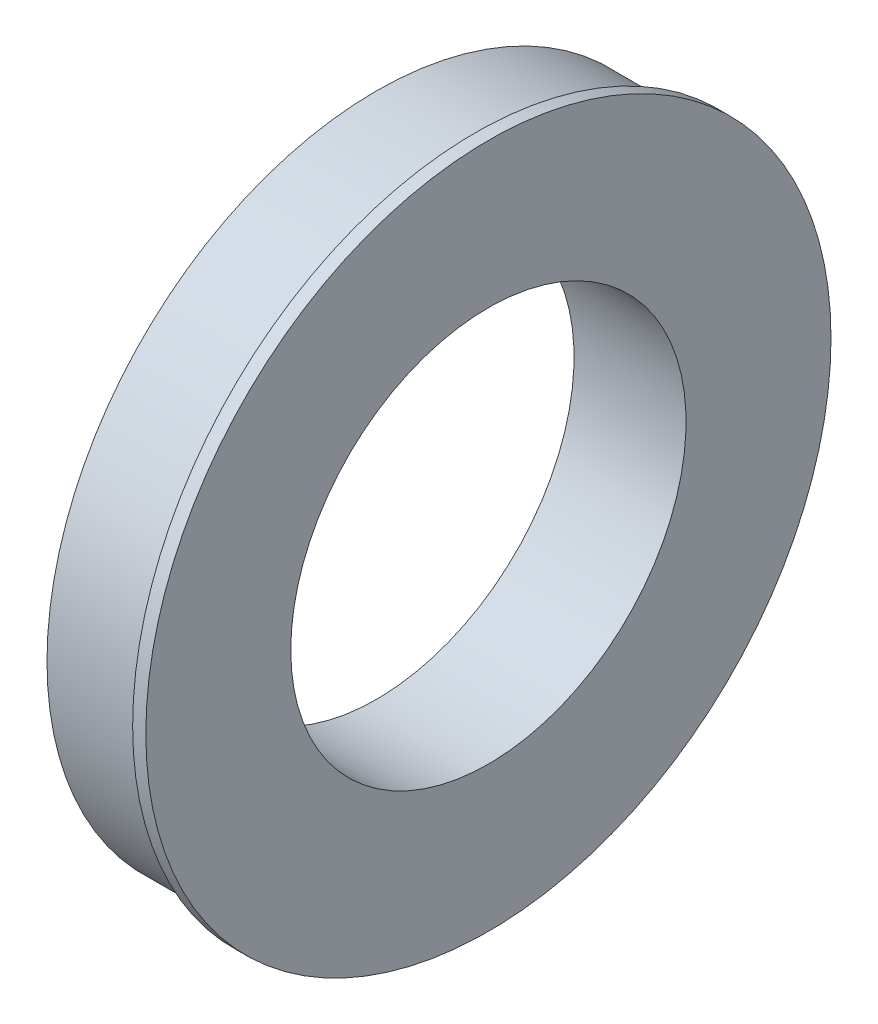
ISO-10303-21;
HEADER;
FILE_DESCRIPTION(('STEP AP214'),'2;1');
FILE_NAME('part.step','',(''),(''),'','','');
FILE_SCHEMA(('AUTOMOTIVE_DESIGN { 1 0 10303 214 1 1 1 1 }'));
ENDSEC;
DATA;
#1=APPLICATION_CONTEXT('core data for automotive mechanical design processes');
#2=APPLICATION_PROTOCOL_DEFINITION('international standard','automotive_design',2000,#1);
#3=PRODUCT_CONTEXT('',#1,'mechanical');
#4=PRODUCT('Part','Part','',(#3));
#5=PRODUCT_RELATED_PRODUCT_CATEGORY('part','',(#4));
#6=PRODUCT_DEFINITION_FORMATION('','',#4);
#7=PRODUCT_DEFINITION_CONTEXT('part definition',#1,'design');
#8=PRODUCT_DEFINITION('design','',#6,#7);
#9=PRODUCT_DEFINITION_SHAPE('','',#8);
#10=(LENGTH_UNIT() NAMED_UNIT(*) SI_UNIT(.MILLI.,.METRE.));
#11=(NAMED_UNIT(*) PLANE_ANGLE_UNIT() SI_UNIT($,.RADIAN.));
#12=(NAMED_UNIT(*) SI_UNIT($,.STERADIAN.) SOLID_ANGLE_UNIT());
#13=UNCERTAINTY_MEASURE_WITH_UNIT(LENGTH_MEASURE(1.E-05),#10,'distance_accuracy_value','');
#14=(GEOMETRIC_REPRESENTATION_CONTEXT(3) GLOBAL_UNCERTAINTY_ASSIGNED_CONTEXT((#13)) GLOBAL_UNIT_ASSIGNED_CONTEXT((#10,
#11,#12)) REPRESENTATION_CONTEXT('',''));
#15=CARTESIAN_POINT('',(0.,0.,0.));
#16=DIRECTION('',(0.,0.,1.));
#17=DIRECTION('',(1.,0.,0.));
#18=AXIS2_PLACEMENT_3D('',#15,#16,#17);
#19=CARTESIAN_POINT('',(0.,0.,0.));
#20=DIRECTION('',(1.,0.,0.));
#21=DIRECTION('',(0.,0.,-1.));
#22=AXIS2_PLACEMENT_3D('',#19,#20,#21);
#23=PLANE('',#22);
#24=CARTESIAN_POINT('',(0.,0.,0.));
#25=DIRECTION('',(1.,0.,0.));
#26=DIRECTION('',(0.,0.,-1.));
#27=AXIS2_PLACEMENT_3D('',#24,#25,#26);
#28=CIRCLE('',#27,63.5);
#29=CARTESIAN_POINT('',(0.,0.,63.5));
#30=VERTEX_POINT('',#29);
#31=EDGE_CURVE('E35',#30,#30,#28,.T.);
#32=ORIENTED_EDGE('',*,*,#31,.F.);
#33=EDGE_LOOP('',(#32));
#34=FACE_BOUND('',#33,.T.);
#35=CARTESIAN_POINT('',(0.,0.,0.));
#36=DIRECTION('',(1.,0.,0.));
#37=DIRECTION('',(0.,0.,-1.));
#38=AXIS2_PLACEMENT_3D('',#35,#36,#37);
#39=CIRCLE('',#38,38.1);
#40=CARTESIAN_POINT('',(0.,0.,38.1));
#41=VERTEX_POINT('',#40);
#42=EDGE_CURVE('E42',#41,#41,#39,.T.);
#43=ORIENTED_EDGE('',*,*,#42,.T.);
#44=EDGE_LOOP('',(#43));
#45=FACE_BOUND('',#44,.T.);
#46=ADVANCED_FACE('F31',(#34,#45),#23,.F.);
#47=CARTESIAN_POINT('',(19.05,0.,0.));
#48=DIRECTION('',(-1.,0.,0.));
#49=DIRECTION('',(0.,0.,1.));
#50=AXIS2_PLACEMENT_3D('',#47,#48,#49);
#51=CYLINDRICAL_SURFACE('',#50,63.5);
#52=CARTESIAN_POINT('',(19.05,0.,0.));
#53=DIRECTION('',(1.,0.,0.));
#54=DIRECTION('',(0.,0.,-1.));
#55=AXIS2_PLACEMENT_3D('',#52,#53,#54);
#56=CIRCLE('',#55,63.5);
#57=CARTESIAN_POINT('',(19.05,0.,63.5));
#58=VERTEX_POINT('',#57);
#59=EDGE_CURVE('E10',#58,#58,#56,.T.);
#60=CARTESIAN_POINT('',(19.05,0.,63.5));
#61=CARTESIAN_POINT('',(18.8515625,0.,63.5));
#62=CARTESIAN_POINT('',(18.653125,0.,63.5));
#63=CARTESIAN_POINT('',(18.25625,0.,63.5));
#64=CARTESIAN_POINT('',(18.0578125,0.,63.5));
#65=CARTESIAN_POINT('',(17.6609375,0.,63.5));
#66=CARTESIAN_POINT('',(17.4625,0.,63.5));
#67=CARTESIAN_POINT('',(17.065625,0.,63.5));
#68=CARTESIAN_POINT('',(16.8671875,0.,63.5));
#69=CARTESIAN_POINT('',(16.4703125,0.,63.5));
#70=CARTESIAN_POINT('',(16.271875,0.,63.5));
#71=CARTESIAN_POINT('',(15.875,0.,63.5));
#72=CARTESIAN_POINT('',(15.6765625,0.,63.5));
#73=CARTESIAN_POINT('',(15.2796875,0.,63.5));
#74=CARTESIAN_POINT('',(15.08125,0.,63.5));
#75=CARTESIAN_POINT('',(14.684375,0.,63.5));
#76=CARTESIAN_POINT('',(14.4859375,0.,63.5));
#77=CARTESIAN_POINT('',(14.0890625,0.,63.5));
#78=CARTESIAN_POINT('',(13.890625,0.,63.5));
#79=CARTESIAN_POINT('',(13.49375,0.,63.5));
#80=CARTESIAN_POINT('',(13.2953125,0.,63.5));
#81=CARTESIAN_POINT('',(12.8984375,0.,63.5));
#82=CARTESIAN_POINT('',(12.7,0.,63.5));
#83=CARTESIAN_POINT('',(12.303125,0.,63.5));
#84=CARTESIAN_POINT('',(12.1046875,0.,63.5));
#85=CARTESIAN_POINT('',(11.7078125,0.,63.5));
#86=CARTESIAN_POINT('',(11.509375,0.,63.5));
#87=CARTESIAN_POINT('',(11.1125,0.,63.5));
#88=CARTESIAN_POINT('',(10.9140625,0.,63.5));
#89=CARTESIAN_POINT('',(10.5171875,0.,63.5));
#90=CARTESIAN_POINT('',(10.31875,0.,63.5));
#91=CARTESIAN_POINT('',(9.921875,0.,63.5));
#92=CARTESIAN_POINT('',(9.7234375,0.,63.5));
#93=CARTESIAN_POINT('',(9.3265625,0.,63.5));
#94=CARTESIAN_POINT('',(9.128125,0.,63.5));
#95=CARTESIAN_POINT('',(8.73125,0.,63.5));
#96=CARTESIAN_POINT('',(8.5328125,0.,63.5));
#97=CARTESIAN_POINT('',(8.1359375,0.,63.5));
#98=CARTESIAN_POINT('',(7.9375,0.,63.5));
#99=CARTESIAN_POINT('',(7.540625,0.,63.5));
#100=CARTESIAN_POINT('',(7.3421875,0.,63.5));
#101=CARTESIAN_POINT('',(6.9453125,0.,63.5));
#102=CARTESIAN_POINT('',(6.746875,0.,63.5));
#103=CARTESIAN_POINT('',(6.35,0.,63.5));
#104=CARTESIAN_POINT('',(6.1515625,0.,63.5));
#105=CARTESIAN_POINT('',(5.7546875,0.,63.5));
#106=CARTESIAN_POINT('',(5.55625,0.,63.5));
#107=CARTESIAN_POINT('',(5.159375,0.,63.5));
#108=CARTESIAN_POINT('',(4.9609375,0.,63.5));
#109=CARTESIAN_POINT('',(4.5640625,0.,63.5));
#110=CARTESIAN_POINT('',(4.365625,0.,63.5));
#111=CARTESIAN_POINT('',(3.96875,0.,63.5));
#112=CARTESIAN_POINT('',(3.7703125,0.,63.5));
#113=CARTESIAN_POINT('',(3.3734375,0.,63.5));
#114=CARTESIAN_POINT('',(3.175,0.,63.5));
#115=CARTESIAN_POINT('',(2.778125,0.,63.5));
#116=CARTESIAN_POINT('',(2.5796875,0.,63.5));
#117=CARTESIAN_POINT('',(2.1828125,0.,63.5));
#118=CARTESIAN_POINT('',(1.984375,0.,63.5));
#119=CARTESIAN_POINT('',(1.5875,0.,63.5));
#120=CARTESIAN_POINT('',(1.3890625,0.,63.5));
#121=CARTESIAN_POINT('',(0.992187500000001,0.,63.5));
#122=CARTESIAN_POINT('',(0.793750000000001,0.,63.5));
#123=CARTESIAN_POINT('',(0.396875,0.,63.5));
#124=CARTESIAN_POINT('',(0.1984375,0.,63.5));
#125=CARTESIAN_POINT('',(0.,0.,63.5));
#126=B_SPLINE_CURVE_WITH_KNOTS('',3,(#60,#61,#62,#63,#64,#65,#66,#67,#68,#69,#70,#71,#72,#73,
#74,#75,#76,#77,#78,#79,#80,#81,#82,#83,#84,#85,#86,#87,#88,#89,#90,#91,#92,#93,#94,#95,#96,#97,
#98,#99,#100,#101,#102,#103,#104,#105,#106,#107,#108,#109,#110,#111,#112,#113,#114,#115,#116,
#117,#118,#119,#120,#121,#122,#123,#124,#125),.UNSPECIFIED.,.F.,.F.,(4,2,2,2,2,2,2,2,2,2,2,2,2,
2,2,2,2,2,2,2,2,2,2,2,2,2,2,2,2,2,2,2,4),(0.,0.5953125,1.190625,1.7859375,2.38125,2.9765625,
3.571875,4.1671875,4.7625,5.3578125,5.953125,6.5484375,7.14375,7.7390625,8.334375,8.9296875,
9.525,10.1203125,10.715625,11.3109375,11.90625,12.5015625,13.096875,13.6921875,14.2875,
14.8828125,15.478125,16.0734375,16.66875,17.2640625,17.859375,18.4546875,19.05),.UNSPECIFIED.);
#127=EDGE_CURVE('BSEAM33',#58,#30,#126,.T.);
#128=ORIENTED_EDGE('',*,*,#59,.F.);
#129=ORIENTED_EDGE('',*,*,#31,.T.);
#130=ORIENTED_EDGE('',*,*,#127,.T.);
#131=ORIENTED_EDGE('',*,*,#127,.F.);
#132=EDGE_LOOP('',(#128,#130,#129,#131));
#133=FACE_BOUND('',#132,.T.);
#134=ADVANCED_FACE('F33',(#133),#51,.T.);
#135=CARTESIAN_POINT('',(19.05,0.,0.));
#136=DIRECTION('',(-1.,0.,0.));
#137=DIRECTION('',(0.,0.,1.));
#138=AXIS2_PLACEMENT_3D('',#135,#136,#137);
#139=CYLINDRICAL_SURFACE('',#138,38.1);
#140=CARTESIAN_POINT('',(21.59,0.,0.));
#141=DIRECTION('',(1.,0.,0.));
#142=DIRECTION('',(0.,0.,-1.));
#143=AXIS2_PLACEMENT_3D('',#140,#141,#142);
#144=CIRCLE('',#143,38.1);
#145=CARTESIAN_POINT('',(21.59,0.,38.1));
#146=VERTEX_POINT('',#145);
#147=EDGE_CURVE('E50',#146,#146,#144,.T.);
#148=CARTESIAN_POINT('',(0.,0.,38.1));
#149=CARTESIAN_POINT('',(0.224895833333333,0.,38.1));
#150=CARTESIAN_POINT('',(0.449791666666667,0.,38.1));
#151=CARTESIAN_POINT('',(0.899583333333333,0.,38.1));
#152=CARTESIAN_POINT('',(1.12447916666667,0.,38.1));
#153=CARTESIAN_POINT('',(1.57427083333333,0.,38.1));
#154=CARTESIAN_POINT('',(1.79916666666667,0.,38.1));
#155=CARTESIAN_POINT('',(2.24895833333333,0.,38.1));
#156=CARTESIAN_POINT('',(2.47385416666667,0.,38.1));
#157=CARTESIAN_POINT('',(2.92364583333333,0.,38.1));
#158=CARTESIAN_POINT('',(3.14854166666667,0.,38.1));
#159=CARTESIAN_POINT('',(3.59833333333333,0.,38.1));
#160=CARTESIAN_POINT('',(3.82322916666667,0.,38.1));
#161=CARTESIAN_POINT('',(4.27302083333333,0.,38.1));
#162=CARTESIAN_POINT('',(4.49791666666667,0.,38.1));
#163=CARTESIAN_POINT('',(4.94770833333333,0.,38.1));
#164=CARTESIAN_POINT('',(5.17260416666667,0.,38.1));
#165=CARTESIAN_POINT('',(5.62239583333333,0.,38.1));
#166=CARTESIAN_POINT('',(5.84729166666667,0.,38.1));
#167=CARTESIAN_POINT('',(6.29708333333333,0.,38.1));
#168=CARTESIAN_POINT('',(6.52197916666667,0.,38.1));
#169=CARTESIAN_POINT('',(6.97177083333333,0.,38.1));
#170=CARTESIAN_POINT('',(7.19666666666667,0.,38.1));
#171=CARTESIAN_POINT('',(7.64645833333333,0.,38.1));
#172=CARTESIAN_POINT('',(7.87135416666667,0.,38.1));
#173=CARTESIAN_POINT('',(8.32114583333333,0.,38.1));
#174=CARTESIAN_POINT('',(8.54604166666667,0.,38.1));
#175=CARTESIAN_POINT('',(8.99583333333334,0.,38.1));
#176=CARTESIAN_POINT('',(9.22072916666667,0.,38.1));
#177=CARTESIAN_POINT('',(9.67052083333333,0.,38.1));
#178=CARTESIAN_POINT('',(9.89541666666667,0.,38.1));
#179=CARTESIAN_POINT('',(10.3452083333333,0.,38.1));
#180=CARTESIAN_POINT('',(10.5701041666667,0.,38.1));
#181=CARTESIAN_POINT('',(11.0198958333333,0.,38.1));
#182=CARTESIAN_POINT('',(11.2447916666667,0.,38.1));
#183=CARTESIAN_POINT('',(11.6945833333333,0.,38.1));
#184=CARTESIAN_POINT('',(11.9194791666667,0.,38.1));
#185=CARTESIAN_POINT('',(12.3692708333333,0.,38.1));
#186=CARTESIAN_POINT('',(12.5941666666667,0.,38.1));
#187=CARTESIAN_POINT('',(13.0439583333333,0.,38.1));
#188=CARTESIAN_POINT('',(13.2688541666667,0.,38.1));
#189=CARTESIAN_POINT('',(13.7186458333333,0.,38.1));
#190=CARTESIAN_POINT('',(13.9435416666667,0.,38.1));
#191=CARTESIAN_POINT('',(14.3933333333333,0.,38.1));
#192=CARTESIAN_POINT('',(14.6182291666667,0.,38.1));
#193=CARTESIAN_POINT('',(15.0680208333333,0.,38.1));
#194=CARTESIAN_POINT('',(15.2929166666667,0.,38.1));
#195=CARTESIAN_POINT('',(15.7427083333333,0.,38.1));
#196=CARTESIAN_POINT('',(15.9676041666667,0.,38.1));
#197=CARTESIAN_POINT('',(16.4173958333333,0.,38.1));
#198=CARTESIAN_POINT('',(16.6422916666667,0.,38.1));
#199=CARTESIAN_POINT('',(17.0920833333333,0.,38.1));
#200=CARTESIAN_POINT('',(17.3169791666667,0.,38.1));
#201=CARTESIAN_POINT('',(17.7667708333333,0.,38.1));
#202=CARTESIAN_POINT('',(17.9916666666667,0.,38.1));
#203=CARTESIAN_POINT('',(18.4414583333333,0.,38.1));
#204=CARTESIAN_POINT('',(18.6663541666667,0.,38.1));
#205=CARTESIAN_POINT('',(19.1161458333333,0.,38.1));
#206=CARTESIAN_POINT('',(19.3410416666667,0.,38.1));
#207=CARTESIAN_POINT('',(19.7908333333333,0.,38.1));
#208=CARTESIAN_POINT('',(20.0157291666667,0.,38.1));
#209=CARTESIAN_POINT('',(20.4655208333333,0.,38.1));
#210=CARTESIAN_POINT('',(20.6904166666667,0.,38.1));
#211=CARTESIAN_POINT('',(21.1402083333333,0.,38.1));
#212=CARTESIAN_POINT('',(21.3651041666667,0.,38.1));
#213=CARTESIAN_POINT('',(21.59,0.,38.1));
#214=B_SPLINE_CURVE_WITH_KNOTS('',3,(#148,#149,#150,#151,#152,#153,#154,#155,#156,#157,#158,
#159,#160,#161,#162,#163,#164,#165,#166,#167,#168,#169,#170,#171,#172,#173,#174,#175,#176,#177,
#178,#179,#180,#181,#182,#183,#184,#185,#186,#187,#188,#189,#190,#191,#192,#193,#194,#195,#196,
#197,#198,#199,#200,#201,#202,#203,#204,#205,#206,#207,#208,#209,#210,#211,#212,#213),
.UNSPECIFIED.,.F.,.F.,(4,2,2,2,2,2,2,2,2,2,2,2,2,2,2,2,2,2,2,2,2,2,2,2,2,2,2,2,2,2,2,2,4),(0.,
0.6746875,1.349375,2.0240625,2.69875,3.3734375,4.048125,4.7228125,5.3975,6.0721875,6.746875,
7.4215625,8.09625,8.7709375,9.445625,10.1203125,10.795,11.4696875,12.144375,12.8190625,13.49375,
14.1684375,14.843125,15.5178125,16.1925,16.8671875,17.541875,18.2165625,18.89125,19.5659375,
20.240625,20.9153125,21.59),.UNSPECIFIED.);
#215=EDGE_CURVE('BSEAM56',#41,#146,#214,.T.);
#216=ORIENTED_EDGE('',*,*,#42,.F.);
#217=ORIENTED_EDGE('',*,*,#147,.T.);
#218=ORIENTED_EDGE('',*,*,#215,.T.);
#219=ORIENTED_EDGE('',*,*,#215,.F.);
#220=EDGE_LOOP('',(#216,#218,#217,#219));
#221=FACE_BOUND('',#220,.T.);
#222=ADVANCED_FACE('F56',(#221),#139,.F.);
#223=CARTESIAN_POINT('',(21.59,0.,0.));
#224=DIRECTION('',(1.,0.,0.));
#225=DIRECTION('',(0.,0.,-1.));
#226=AXIS2_PLACEMENT_3D('',#223,#224,#225);
#227=PLANE('',#226);
#228=CARTESIAN_POINT('',(21.59,0.,0.));
#229=DIRECTION('',(1.,0.,0.));
#230=DIRECTION('',(0.,0.,-1.));
#231=AXIS2_PLACEMENT_3D('',#228,#229,#230);
#232=CIRCLE('',#231,66.04);
#233=CARTESIAN_POINT('',(21.59,0.,-66.04));
#234=VERTEX_POINT('',#233);
#235=EDGE_CURVE('E46',#234,#234,#232,.T.);
#236=ORIENTED_EDGE('',*,*,#235,.T.);
#237=EDGE_LOOP('',(#236));
#238=FACE_BOUND('',#237,.T.);
#239=ORIENTED_EDGE('',*,*,#147,.F.);
#240=EDGE_LOOP('',(#239));
#241=FACE_BOUND('',#240,.T.);
#242=ADVANCED_FACE('F58',(#238,#241),#227,.T.);
#243=CARTESIAN_POINT('',(19.05,0.,0.));
#244=DIRECTION('',(1.,0.,0.));
#245=DIRECTION('',(0.,0.,-1.));
#246=AXIS2_PLACEMENT_3D('',#243,#244,#245);
#247=PLANE('',#246);
#248=ORIENTED_EDGE('',*,*,#59,.T.);
#249=EDGE_LOOP('',(#248));
#250=FACE_BOUND('',#249,.T.);
#251=CARTESIAN_POINT('',(19.05,0.,0.));
#252=DIRECTION('',(1.,0.,0.));
#253=DIRECTION('',(0.,0.,-1.));
#254=AXIS2_PLACEMENT_3D('',#251,#252,#253);
#255=CIRCLE('',#254,66.04);
#256=CARTESIAN_POINT('',(19.05,0.,-66.04));
#257=VERTEX_POINT('',#256);
#258=EDGE_CURVE('E47',#257,#257,#255,.T.);
#259=ORIENTED_EDGE('',*,*,#258,.F.);
#260=EDGE_LOOP('',(#259));
#261=FACE_BOUND('',#260,.T.);
#262=ADVANCED_FACE('F60',(#250,#261),#247,.F.);
#263=CARTESIAN_POINT('',(21.59,0.,0.));
#264=DIRECTION('',(-1.,0.,0.));
#265=DIRECTION('',(0.,0.,1.));
#266=AXIS2_PLACEMENT_3D('',#263,#264,#265);
#267=CYLINDRICAL_SURFACE('',#266,66.04);
#268=ORIENTED_EDGE('',*,*,#235,.F.);
#269=EDGE_LOOP('',(#268));
#270=FACE_BOUND('',#269,.T.);
#271=ORIENTED_EDGE('',*,*,#258,.T.);
#272=EDGE_LOOP('',(#271));
#273=FACE_BOUND('',#272,.T.);
#274=ADVANCED_FACE('F67',(#270,#273),#267,.T.);
#275=CLOSED_SHELL('',(#46,#134,#222,#242,#262,#274));
#276=MANIFOLD_SOLID_BREP('B2',#275);
#277=ADVANCED_BREP_SHAPE_REPRESENTATION('',(#18,#276),#14);
#278=SHAPE_DEFINITION_REPRESENTATION(#9,#277);
ENDSEC;
END-ISO-10303-21;
